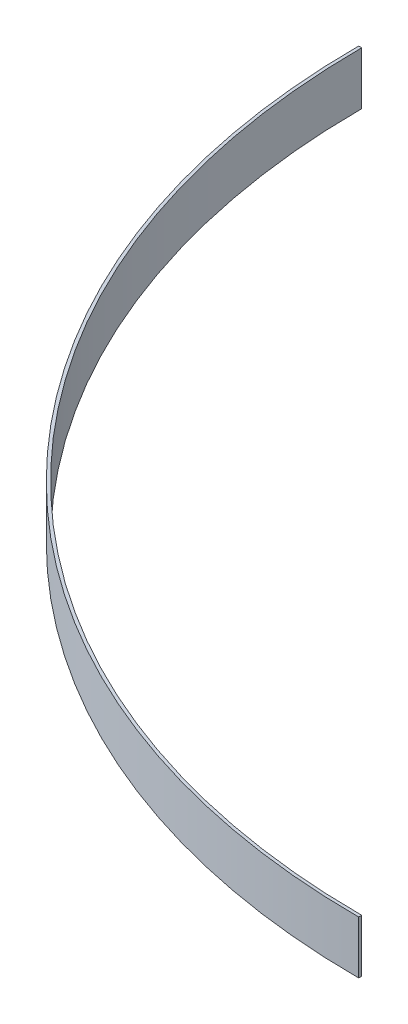
ISO-10303-21;
HEADER;
FILE_DESCRIPTION(('STEP AP214'),'2;1');
FILE_NAME('part.step','',(''),(''),'','','');
FILE_SCHEMA(('AUTOMOTIVE_DESIGN { 1 0 10303 214 1 1 1 1 }'));
ENDSEC;
DATA;
#1=APPLICATION_CONTEXT('core data for automotive mechanical design processes');
#2=APPLICATION_PROTOCOL_DEFINITION('international standard','automotive_design',2000,#1);
#3=PRODUCT_CONTEXT('',#1,'mechanical');
#4=PRODUCT('Part','Part','',(#3));
#5=PRODUCT_RELATED_PRODUCT_CATEGORY('part','',(#4));
#6=PRODUCT_DEFINITION_FORMATION('','',#4);
#7=PRODUCT_DEFINITION_CONTEXT('part definition',#1,'design');
#8=PRODUCT_DEFINITION('design','',#6,#7);
#9=PRODUCT_DEFINITION_SHAPE('','',#8);
#10=(LENGTH_UNIT() NAMED_UNIT(*) SI_UNIT(.MILLI.,.METRE.));
#11=(NAMED_UNIT(*) PLANE_ANGLE_UNIT() SI_UNIT($,.RADIAN.));
#12=(NAMED_UNIT(*) SI_UNIT($,.STERADIAN.) SOLID_ANGLE_UNIT());
#13=UNCERTAINTY_MEASURE_WITH_UNIT(LENGTH_MEASURE(1.E-05),#10,'distance_accuracy_value','');
#14=(GEOMETRIC_REPRESENTATION_CONTEXT(3) GLOBAL_UNCERTAINTY_ASSIGNED_CONTEXT((#13)) GLOBAL_UNIT_ASSIGNED_CONTEXT((#10,
#11,#12)) REPRESENTATION_CONTEXT('',''));
#15=CARTESIAN_POINT('',(0.,0.,0.));
#16=DIRECTION('',(0.,0.,1.));
#17=DIRECTION('',(1.,0.,0.));
#18=AXIS2_PLACEMENT_3D('',#15,#16,#17);
#19=CARTESIAN_POINT('',(-92.5000000000001,35.,92.5));
#20=DIRECTION('',(0.,-1.,0.));
#21=DIRECTION('',(0.,0.,-1.));
#22=AXIS2_PLACEMENT_3D('',#19,#20,#21);
#23=PLANE('',#22);
#24=DIRECTION('',(1.,0.,0.));
#25=VECTOR('',#24,1.);
#26=CARTESIAN_POINT('',(-590.5,35.,92.4999999999982));
#27=LINE('',#26,#25);
#28=CARTESIAN_POINT('',(-592.5,35.,92.4999999999982));
#29=VERTEX_POINT('',#28);
#30=CARTESIAN_POINT('',(-590.5,35.,92.4999999999982));
#31=VERTEX_POINT('',#30);
#32=EDGE_CURVE('E11',#29,#31,#27,.T.);
#33=ORIENTED_EDGE('',*,*,#32,.F.);
#34=CARTESIAN_POINT('',(-92.5000000000001,35.,92.5));
#35=DIRECTION('',(0.,1.,0.));
#36=DIRECTION('',(0.,0.,1.));
#37=AXIS2_PLACEMENT_3D('',#34,#35,#36);
#38=CIRCLE('',#37,500.);
#39=CARTESIAN_POINT('',(-92.5,35.,592.5));
#40=VERTEX_POINT('',#39);
#41=EDGE_CURVE('E72',#29,#40,#38,.T.);
#42=ORIENTED_EDGE('',*,*,#41,.T.);
#43=DIRECTION('',(0.,0.,-1.));
#44=VECTOR('',#43,1.);
#45=CARTESIAN_POINT('',(-92.5000000000001,35.,590.5));
#46=LINE('',#45,#44);
#47=CARTESIAN_POINT('',(-92.5000000000001,35.,590.5));
#48=VERTEX_POINT('',#47);
#49=EDGE_CURVE('E46',#40,#48,#46,.T.);
#50=ORIENTED_EDGE('',*,*,#49,.T.);
#51=CARTESIAN_POINT('',(-92.5000000000001,35.,92.5));
#52=DIRECTION('',(0.,1.,0.));
#53=DIRECTION('',(0.,0.,1.));
#54=AXIS2_PLACEMENT_3D('',#51,#52,#53);
#55=CIRCLE('',#54,498.);
#56=EDGE_CURVE('E75',#31,#48,#55,.T.);
#57=ORIENTED_EDGE('',*,*,#56,.F.);
#58=EDGE_LOOP('',(#33,#42,#50,#57));
#59=FACE_BOUND('',#58,.T.);
#60=ADVANCED_FACE('F36',(#59),#23,.F.);
#61=CARTESIAN_POINT('',(-92.5,17.5,590.5));
#62=DIRECTION('',(-1.,0.,0.));
#63=DIRECTION('',(0.,-1.,0.));
#64=AXIS2_PLACEMENT_3D('',#61,#62,#63);
#65=PLANE('',#64);
#66=ORIENTED_EDGE('',*,*,#49,.F.);
#67=DIRECTION('',(0.,1.,0.));
#68=VECTOR('',#67,1.);
#69=CARTESIAN_POINT('',(-92.5,-766.399461906222,592.5));
#70=LINE('',#69,#68);
#71=CARTESIAN_POINT('',(-92.5,0.,592.5));
#72=VERTEX_POINT('',#71);
#73=EDGE_CURVE('E87',#40,#72,#70,.F.);
#74=ORIENTED_EDGE('',*,*,#73,.T.);
#75=DIRECTION('',(0.,0.,-1.));
#76=VECTOR('',#75,1.);
#77=CARTESIAN_POINT('',(-92.5,0.,590.5));
#78=LINE('',#77,#76);
#79=CARTESIAN_POINT('',(-92.5,0.,590.5));
#80=VERTEX_POINT('',#79);
#81=EDGE_CURVE('E96',#72,#80,#78,.T.);
#82=ORIENTED_EDGE('',*,*,#81,.T.);
#83=DIRECTION('',(0.,-1.,0.));
#84=VECTOR('',#83,1.);
#85=CARTESIAN_POINT('',(-92.5,35.,590.5));
#86=LINE('',#85,#84);
#87=EDGE_CURVE('E91',#48,#80,#86,.T.);
#88=ORIENTED_EDGE('',*,*,#87,.F.);
#89=EDGE_LOOP('',(#66,#74,#82,#88));
#90=FACE_BOUND('',#89,.T.);
#91=ADVANCED_FACE('F104',(#90),#65,.F.);
#92=CARTESIAN_POINT('',(-92.5000000000001,0.,92.5));
#93=DIRECTION('',(0.,1.,0.));
#94=DIRECTION('',(0.,0.,1.));
#95=AXIS2_PLACEMENT_3D('',#92,#93,#94);
#96=PLANE('',#95);
#97=ORIENTED_EDGE('',*,*,#81,.F.);
#98=CARTESIAN_POINT('',(-92.5000000000001,0.,92.5));
#99=DIRECTION('',(0.,1.,0.));
#100=DIRECTION('',(0.,0.,1.));
#101=AXIS2_PLACEMENT_3D('',#98,#99,#100);
#102=CIRCLE('',#101,500.);
#103=CARTESIAN_POINT('',(-592.5,0.,92.4999999999982));
#104=VERTEX_POINT('',#103);
#105=EDGE_CURVE('E89',#72,#104,#102,.F.);
#106=ORIENTED_EDGE('',*,*,#105,.T.);
#107=DIRECTION('',(1.,0.,0.));
#108=VECTOR('',#107,1.);
#109=CARTESIAN_POINT('',(-590.5,0.,92.4999999999984));
#110=LINE('',#109,#108);
#111=CARTESIAN_POINT('',(-590.5,0.,92.4999999999984));
#112=VERTEX_POINT('',#111);
#113=EDGE_CURVE('E40',#104,#112,#110,.T.);
#114=ORIENTED_EDGE('',*,*,#113,.T.);
#115=CARTESIAN_POINT('',(-92.5000000000001,0.,92.5));
#116=DIRECTION('',(0.,-1.,0.));
#117=DIRECTION('',(0.,0.,-1.));
#118=AXIS2_PLACEMENT_3D('',#115,#116,#117);
#119=CIRCLE('',#118,498.);
#120=EDGE_CURVE('E105',#80,#112,#119,.T.);
#121=ORIENTED_EDGE('',*,*,#120,.F.);
#122=EDGE_LOOP('',(#97,#106,#114,#121));
#123=FACE_BOUND('',#122,.T.);
#124=ADVANCED_FACE('F109',(#123),#96,.F.);
#125=CARTESIAN_POINT('',(-590.5,17.5,92.4999999999981));
#126=DIRECTION('',(0.,0.,1.));
#127=DIRECTION('',(0.,1.,0.));
#128=AXIS2_PLACEMENT_3D('',#125,#126,#127);
#129=PLANE('',#128);
#130=DIRECTION('',(0.,1.,0.));
#131=VECTOR('',#130,1.);
#132=CARTESIAN_POINT('',(-592.5,-766.399461906222,92.4999999999982));
#133=LINE('',#132,#131);
#134=EDGE_CURVE('E85',#104,#29,#133,.T.);
#135=ORIENTED_EDGE('',*,*,#134,.T.);
#136=ORIENTED_EDGE('',*,*,#32,.T.);
#137=DIRECTION('',(0.,1.,0.));
#138=VECTOR('',#137,1.);
#139=CARTESIAN_POINT('',(-590.5,0.,92.4999999999981));
#140=LINE('',#139,#138);
#141=EDGE_CURVE('E103',#112,#31,#140,.T.);
#142=ORIENTED_EDGE('',*,*,#141,.F.);
#143=ORIENTED_EDGE('',*,*,#113,.F.);
#144=EDGE_LOOP('',(#135,#136,#142,#143));
#145=FACE_BOUND('',#144,.T.);
#146=ADVANCED_FACE('F38',(#145),#129,.F.);
#147=CARTESIAN_POINT('',(-92.5000000000001,-766.399461906222,92.5));
#148=DIRECTION('',(0.,1.,0.));
#149=DIRECTION('',(0.,0.,1.));
#150=AXIS2_PLACEMENT_3D('',#147,#148,#149);
#151=CYLINDRICAL_SURFACE('',#150,498.);
#152=ORIENTED_EDGE('',*,*,#120,.T.);
#153=ORIENTED_EDGE('',*,*,#141,.T.);
#154=ORIENTED_EDGE('',*,*,#56,.T.);
#155=ORIENTED_EDGE('',*,*,#87,.T.);
#156=EDGE_LOOP('',(#152,#153,#154,#155));
#157=FACE_BOUND('',#156,.T.);
#158=ADVANCED_FACE('F102',(#157),#151,.F.);
#159=CARTESIAN_POINT('',(-92.5000000000001,-766.399461906222,92.5));
#160=DIRECTION('',(0.,1.,0.));
#161=DIRECTION('',(0.,0.,1.));
#162=AXIS2_PLACEMENT_3D('',#159,#160,#161);
#163=CYLINDRICAL_SURFACE('',#162,500.);
#164=ORIENTED_EDGE('',*,*,#105,.F.);
#165=ORIENTED_EDGE('',*,*,#73,.F.);
#166=ORIENTED_EDGE('',*,*,#41,.F.);
#167=ORIENTED_EDGE('',*,*,#134,.F.);
#168=EDGE_LOOP('',(#164,#165,#166,#167));
#169=FACE_BOUND('',#168,.T.);
#170=ADVANCED_FACE('F84',(#169),#163,.T.);
#171=CLOSED_SHELL('',(#60,#91,#124,#146,#158,#170));
#172=MANIFOLD_SOLID_BREP('B2',#171);
#173=ADVANCED_BREP_SHAPE_REPRESENTATION('',(#18,#172),#14);
#174=SHAPE_DEFINITION_REPRESENTATION(#9,#173);
ENDSEC;
END-ISO-10303-21;
